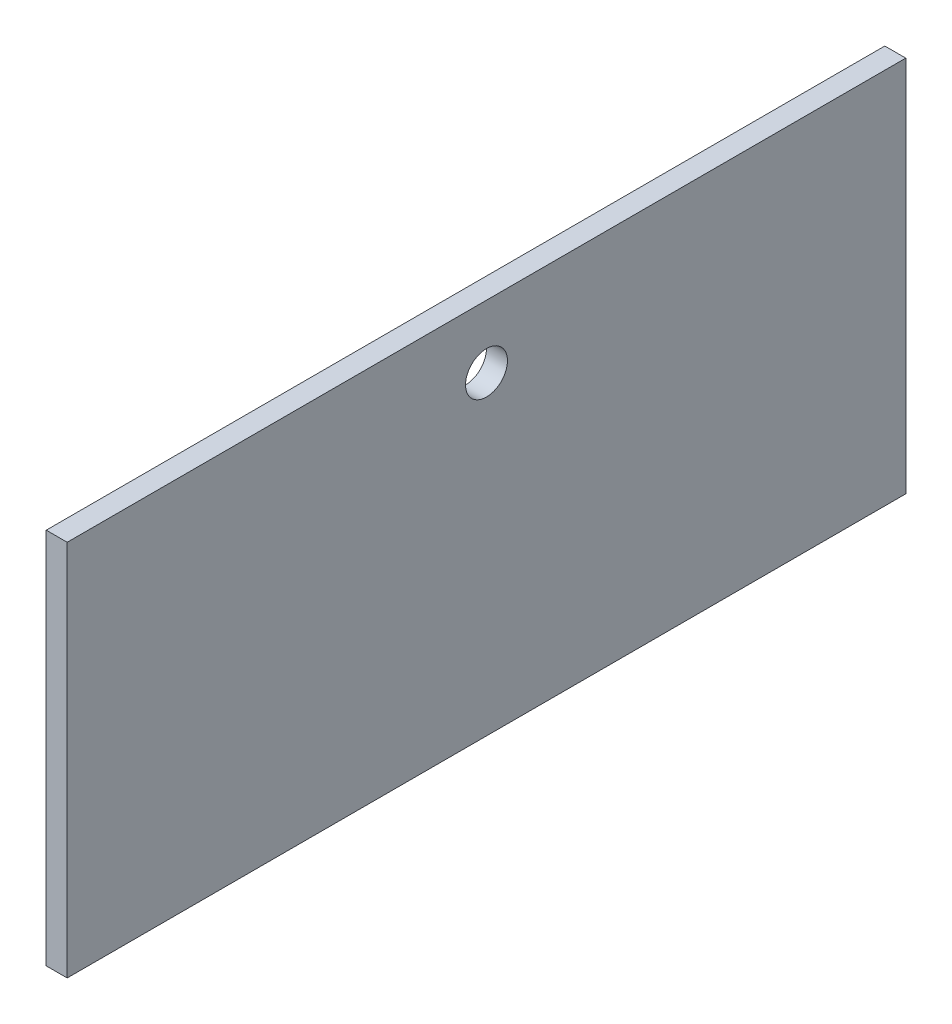
ISO-10303-21;
HEADER;
FILE_DESCRIPTION(('STEP AP214'),'2;1');
FILE_NAME('part.step','',(''),(''),'','','');
FILE_SCHEMA(('AUTOMOTIVE_DESIGN { 1 0 10303 214 1 1 1 1 }'));
ENDSEC;
DATA;
#1=APPLICATION_CONTEXT('core data for automotive mechanical design processes');
#2=APPLICATION_PROTOCOL_DEFINITION('international standard','automotive_design',2000,#1);
#3=PRODUCT_CONTEXT('',#1,'mechanical');
#4=PRODUCT('Part','Part','',(#3));
#5=PRODUCT_RELATED_PRODUCT_CATEGORY('part','',(#4));
#6=PRODUCT_DEFINITION_FORMATION('','',#4);
#7=PRODUCT_DEFINITION_CONTEXT('part definition',#1,'design');
#8=PRODUCT_DEFINITION('design','',#6,#7);
#9=PRODUCT_DEFINITION_SHAPE('','',#8);
#10=(LENGTH_UNIT() NAMED_UNIT(*) SI_UNIT(.MILLI.,.METRE.));
#11=(NAMED_UNIT(*) PLANE_ANGLE_UNIT() SI_UNIT($,.RADIAN.));
#12=(NAMED_UNIT(*) SI_UNIT($,.STERADIAN.) SOLID_ANGLE_UNIT());
#13=UNCERTAINTY_MEASURE_WITH_UNIT(LENGTH_MEASURE(1.E-05),#10,'distance_accuracy_value','');
#14=(GEOMETRIC_REPRESENTATION_CONTEXT(3) GLOBAL_UNCERTAINTY_ASSIGNED_CONTEXT((#13)) GLOBAL_UNIT_ASSIGNED_CONTEXT((#10,
#11,#12)) REPRESENTATION_CONTEXT('',''));
#15=CARTESIAN_POINT('',(0.,0.,0.));
#16=DIRECTION('',(0.,0.,1.));
#17=DIRECTION('',(1.,0.,0.));
#18=AXIS2_PLACEMENT_3D('',#15,#16,#17);
#19=CARTESIAN_POINT('',(-75.,100.,-100.));
#20=DIRECTION('',(1.,0.,0.));
#21=DIRECTION('',(0.,0.,-1.));
#22=AXIS2_PLACEMENT_3D('',#19,#20,#21);
#23=PLANE('',#22);
#24=CARTESIAN_POINT('',(-75.,80.,0.));
#25=DIRECTION('',(-1.,0.,0.));
#26=DIRECTION('',(0.,0.,1.));
#27=AXIS2_PLACEMENT_3D('',#24,#25,#26);
#28=CIRCLE('',#27,5.);
#29=CARTESIAN_POINT('',(-75.,80.,5.00000000000002));
#30=VERTEX_POINT('',#29);
#31=EDGE_CURVE('E164',#30,#30,#28,.T.);
#32=ORIENTED_EDGE('',*,*,#31,.F.);
#33=EDGE_LOOP('',(#32));
#34=FACE_BOUND('',#33,.T.);
#35=DIRECTION('',(0.,0.,1.));
#36=VECTOR('',#35,1.);
#37=CARTESIAN_POINT('',(-75.,95.,-100.));
#38=LINE('',#37,#36);
#39=CARTESIAN_POINT('',(-75.,95.,-100.));
#40=VERTEX_POINT('',#39);
#41=CARTESIAN_POINT('',(-75.,95.,100.));
#42=VERTEX_POINT('',#41);
#43=EDGE_CURVE('E12',#40,#42,#38,.T.);
#44=ORIENTED_EDGE('',*,*,#43,.F.);
#45=DIRECTION('',(0.,-1.,0.));
#46=VECTOR('',#45,1.);
#47=CARTESIAN_POINT('',(-75.,100.,-100.));
#48=LINE('',#47,#46);
#49=CARTESIAN_POINT('',(-75.,5.,-100.));
#50=VERTEX_POINT('',#49);
#51=EDGE_CURVE('E157',#40,#50,#48,.T.);
#52=ORIENTED_EDGE('',*,*,#51,.T.);
#53=DIRECTION('',(0.,0.,1.));
#54=VECTOR('',#53,1.);
#55=CARTESIAN_POINT('',(-75.,5.,-100.));
#56=LINE('',#55,#54);
#57=CARTESIAN_POINT('',(-75.,5.,100.));
#58=VERTEX_POINT('',#57);
#59=EDGE_CURVE('E94',#50,#58,#56,.T.);
#60=ORIENTED_EDGE('',*,*,#59,.T.);
#61=DIRECTION('',(0.,-1.,0.));
#62=VECTOR('',#61,1.);
#63=CARTESIAN_POINT('',(-75.,100.,100.));
#64=LINE('',#63,#62);
#65=EDGE_CURVE('E150',#42,#58,#64,.T.);
#66=ORIENTED_EDGE('',*,*,#65,.F.);
#67=EDGE_LOOP('',(#44,#52,#60,#66));
#68=FACE_BOUND('',#67,.T.);
#69=ADVANCED_FACE('F83',(#34,#68),#23,.F.);
#70=CARTESIAN_POINT('',(-70.,100.,-100.));
#71=DIRECTION('',(1.,0.,0.));
#72=DIRECTION('',(0.,0.,-1.));
#73=AXIS2_PLACEMENT_3D('',#70,#71,#72);
#74=PLANE('',#73);
#75=CARTESIAN_POINT('',(-70.,80.,0.));
#76=DIRECTION('',(1.,0.,0.));
#77=DIRECTION('',(0.,0.,-1.));
#78=AXIS2_PLACEMENT_3D('',#75,#76,#77);
#79=CIRCLE('',#78,5.);
#80=CARTESIAN_POINT('',(-70.,80.,-4.99999999999999));
#81=VERTEX_POINT('',#80);
#82=EDGE_CURVE('E158',#81,#81,#79,.T.);
#83=ORIENTED_EDGE('',*,*,#82,.F.);
#84=EDGE_LOOP('',(#83));
#85=FACE_BOUND('',#84,.T.);
#86=DIRECTION('',(0.,0.,1.));
#87=VECTOR('',#86,1.);
#88=CARTESIAN_POINT('',(-70.,95.,-100.));
#89=LINE('',#88,#87);
#90=CARTESIAN_POINT('',(-70.,95.,-100.));
#91=VERTEX_POINT('',#90);
#92=CARTESIAN_POINT('',(-70.,95.,100.));
#93=VERTEX_POINT('',#92);
#94=EDGE_CURVE('E126',#91,#93,#89,.T.);
#95=ORIENTED_EDGE('',*,*,#94,.T.);
#96=DIRECTION('',(0.,-1.,0.));
#97=VECTOR('',#96,1.);
#98=CARTESIAN_POINT('',(-70.,100.,100.));
#99=LINE('',#98,#97);
#100=CARTESIAN_POINT('',(-70.,5.,100.));
#101=VERTEX_POINT('',#100);
#102=EDGE_CURVE('E132',#93,#101,#99,.T.);
#103=ORIENTED_EDGE('',*,*,#102,.T.);
#104=DIRECTION('',(0.,0.,1.));
#105=VECTOR('',#104,1.);
#106=CARTESIAN_POINT('',(-70.,5.,-100.));
#107=LINE('',#106,#105);
#108=CARTESIAN_POINT('',(-70.,5.,-100.));
#109=VERTEX_POINT('',#108);
#110=EDGE_CURVE('E133',#109,#101,#107,.T.);
#111=ORIENTED_EDGE('',*,*,#110,.F.);
#112=DIRECTION('',(0.,-1.,0.));
#113=VECTOR('',#112,1.);
#114=CARTESIAN_POINT('',(-70.,100.,-100.));
#115=LINE('',#114,#113);
#116=EDGE_CURVE('E134',#91,#109,#115,.T.);
#117=ORIENTED_EDGE('',*,*,#116,.F.);
#118=EDGE_LOOP('',(#95,#103,#111,#117));
#119=FACE_BOUND('',#118,.T.);
#120=ADVANCED_FACE('F127',(#85,#119),#74,.T.);
#121=CARTESIAN_POINT('',(-75.,100.,100.));
#122=DIRECTION('',(0.,0.,-1.));
#123=DIRECTION('',(-1.,0.,0.));
#124=AXIS2_PLACEMENT_3D('',#121,#122,#123);
#125=PLANE('',#124);
#126=ORIENTED_EDGE('',*,*,#102,.F.);
#127=DIRECTION('',(-1.,0.,0.));
#128=VECTOR('',#127,1.);
#129=CARTESIAN_POINT('',(91.4000552291931,95.,100.));
#130=LINE('',#129,#128);
#131=EDGE_CURVE('E139',#93,#42,#130,.T.);
#132=ORIENTED_EDGE('',*,*,#131,.T.);
#133=ORIENTED_EDGE('',*,*,#65,.T.);
#134=DIRECTION('',(-1.,0.,0.));
#135=VECTOR('',#134,1.);
#136=CARTESIAN_POINT('',(91.4000552291931,5.,100.));
#137=LINE('',#136,#135);
#138=EDGE_CURVE('E106',#101,#58,#137,.T.);
#139=ORIENTED_EDGE('',*,*,#138,.F.);
#140=EDGE_LOOP('',(#126,#132,#133,#139));
#141=FACE_BOUND('',#140,.T.);
#142=ADVANCED_FACE('F146',(#141),#125,.F.);
#143=CARTESIAN_POINT('',(-75.,100.,-100.));
#144=DIRECTION('',(0.,0.,1.));
#145=DIRECTION('',(1.,0.,0.));
#146=AXIS2_PLACEMENT_3D('',#143,#144,#145);
#147=PLANE('',#146);
#148=ORIENTED_EDGE('',*,*,#116,.T.);
#149=DIRECTION('',(-1.,0.,0.));
#150=VECTOR('',#149,1.);
#151=CARTESIAN_POINT('',(91.4000552291931,5.,-100.));
#152=LINE('',#151,#150);
#153=EDGE_CURVE('E144',#109,#50,#152,.T.);
#154=ORIENTED_EDGE('',*,*,#153,.T.);
#155=ORIENTED_EDGE('',*,*,#51,.F.);
#156=DIRECTION('',(-1.,0.,0.));
#157=VECTOR('',#156,1.);
#158=CARTESIAN_POINT('',(91.4000552291931,95.,-100.));
#159=LINE('',#158,#157);
#160=EDGE_CURVE('E100',#91,#40,#159,.T.);
#161=ORIENTED_EDGE('',*,*,#160,.F.);
#162=EDGE_LOOP('',(#148,#154,#155,#161));
#163=FACE_BOUND('',#162,.T.);
#164=ADVANCED_FACE('F90',(#163),#147,.F.);
#165=CARTESIAN_POINT('',(-5.,80.,0.));
#166=DIRECTION('',(-1.,0.,0.));
#167=DIRECTION('',(0.,0.,1.));
#168=AXIS2_PLACEMENT_3D('',#165,#166,#167);
#169=CYLINDRICAL_SURFACE('',#168,5.);
#170=ORIENTED_EDGE('',*,*,#82,.T.);
#171=EDGE_LOOP('',(#170));
#172=FACE_BOUND('',#171,.T.);
#173=ORIENTED_EDGE('',*,*,#31,.T.);
#174=EDGE_LOOP('',(#173));
#175=FACE_BOUND('',#174,.T.);
#176=ADVANCED_FACE('F182',(#172,#175),#169,.F.);
#177=CARTESIAN_POINT('',(91.4000552291931,5.,-100.));
#178=DIRECTION('',(0.,1.,0.));
#179=DIRECTION('',(0.,0.,1.));
#180=AXIS2_PLACEMENT_3D('',#177,#178,#179);
#181=PLANE('',#180);
#182=ORIENTED_EDGE('',*,*,#153,.F.);
#183=ORIENTED_EDGE('',*,*,#110,.T.);
#184=ORIENTED_EDGE('',*,*,#138,.T.);
#185=ORIENTED_EDGE('',*,*,#59,.F.);
#186=EDGE_LOOP('',(#182,#183,#184,#185));
#187=FACE_BOUND('',#186,.T.);
#188=ADVANCED_FACE('F168',(#187),#181,.F.);
#189=CARTESIAN_POINT('',(91.4000552291931,95.,-100.));
#190=DIRECTION('',(0.,1.,0.));
#191=DIRECTION('',(0.,0.,1.));
#192=AXIS2_PLACEMENT_3D('',#189,#190,#191);
#193=PLANE('',#192);
#194=ORIENTED_EDGE('',*,*,#43,.T.);
#195=ORIENTED_EDGE('',*,*,#131,.F.);
#196=ORIENTED_EDGE('',*,*,#94,.F.);
#197=ORIENTED_EDGE('',*,*,#160,.T.);
#198=EDGE_LOOP('',(#194,#195,#196,#197));
#199=FACE_BOUND('',#198,.T.);
#200=ADVANCED_FACE('F136',(#199),#193,.T.);
#201=CLOSED_SHELL('',(#69,#120,#142,#164,#176,#188,#200));
#202=MANIFOLD_SOLID_BREP('B2',#201);
#203=ADVANCED_BREP_SHAPE_REPRESENTATION('',(#18,#202),#14);
#204=SHAPE_DEFINITION_REPRESENTATION(#9,#203);
ENDSEC;
END-ISO-10303-21;
